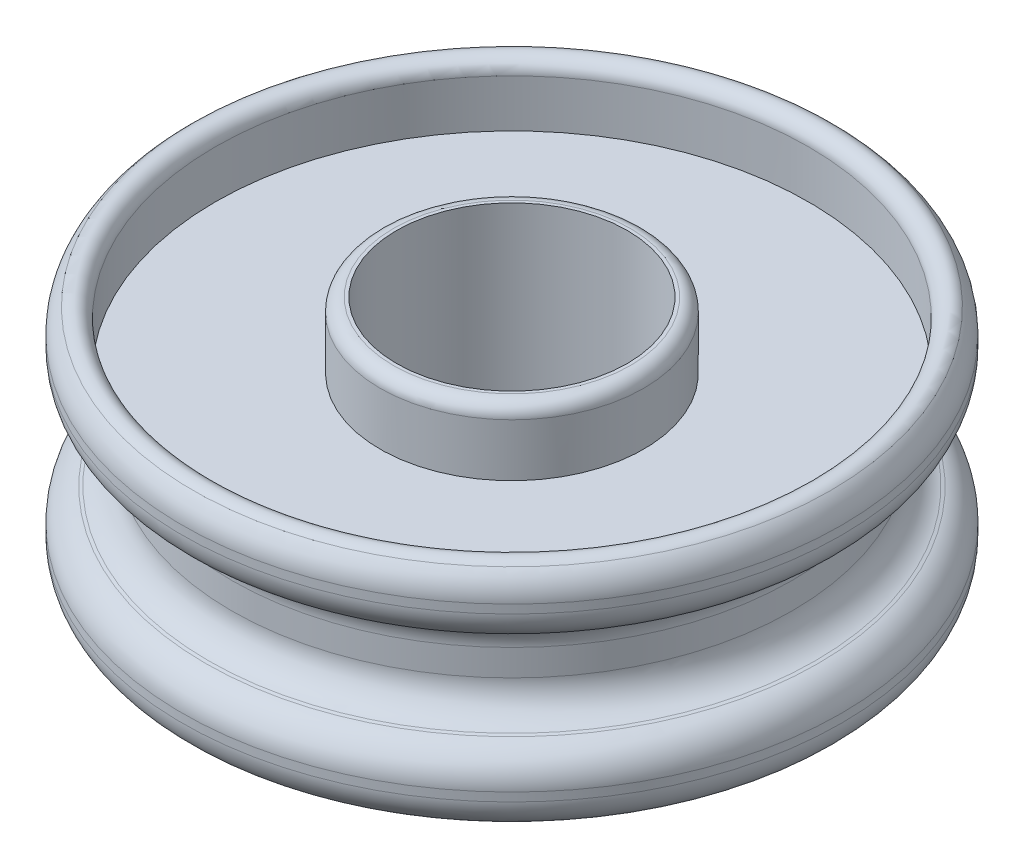
ISO-10303-21;
HEADER;
FILE_DESCRIPTION(('STEP AP214'),'2;1');
FILE_NAME('part.step','',(''),(''),'','','');
FILE_SCHEMA(('AUTOMOTIVE_DESIGN { 1 0 10303 214 1 1 1 1 }'));
ENDSEC;
DATA;
#1=APPLICATION_CONTEXT('core data for automotive mechanical design processes');
#2=APPLICATION_PROTOCOL_DEFINITION('international standard','automotive_design',2000,#1);
#3=PRODUCT_CONTEXT('',#1,'mechanical');
#4=PRODUCT('Part','Part','',(#3));
#5=PRODUCT_RELATED_PRODUCT_CATEGORY('part','',(#4));
#6=PRODUCT_DEFINITION_FORMATION('','',#4);
#7=PRODUCT_DEFINITION_CONTEXT('part definition',#1,'design');
#8=PRODUCT_DEFINITION('design','',#6,#7);
#9=PRODUCT_DEFINITION_SHAPE('','',#8);
#10=(LENGTH_UNIT() NAMED_UNIT(*) SI_UNIT(.MILLI.,.METRE.));
#11=(NAMED_UNIT(*) PLANE_ANGLE_UNIT() SI_UNIT($,.RADIAN.));
#12=(NAMED_UNIT(*) SI_UNIT($,.STERADIAN.) SOLID_ANGLE_UNIT());
#13=UNCERTAINTY_MEASURE_WITH_UNIT(LENGTH_MEASURE(1.E-05),#10,'distance_accuracy_value','');
#14=(GEOMETRIC_REPRESENTATION_CONTEXT(3) GLOBAL_UNCERTAINTY_ASSIGNED_CONTEXT((#13)) GLOBAL_UNIT_ASSIGNED_CONTEXT((#10,
#11,#12)) REPRESENTATION_CONTEXT('',''));
#15=CARTESIAN_POINT('',(0.,0.,0.));
#16=DIRECTION('',(0.,0.,1.));
#17=DIRECTION('',(1.,0.,0.));
#18=AXIS2_PLACEMENT_3D('',#15,#16,#17);
#19=CARTESIAN_POINT('',(0.,-36.0000000000001,0.));
#20=DIRECTION('',(0.,-1.,0.));
#21=DIRECTION('',(1.,0.,0.));
#22=AXIS2_PLACEMENT_3D('',#19,#20,#21);
#23=PLANE('',#22);
#24=CARTESIAN_POINT('',(1.23488963959887E-13,-36.0000000000001,0.));
#25=DIRECTION('',(0.,-1.,0.));
#26=DIRECTION('',(1.,0.,0.));
#27=AXIS2_PLACEMENT_3D('',#24,#25,#26);
#28=CIRCLE('',#27,18.);
#29=CARTESIAN_POINT('',(18.0000000000001,-36.,0.));
#30=VERTEX_POINT('',#29);
#31=EDGE_CURVE('E60',#30,#30,#28,.T.);
#32=ORIENTED_EDGE('',*,*,#31,.T.);
#33=EDGE_LOOP('',(#32));
#34=FACE_BOUND('',#33,.T.);
#35=CARTESIAN_POINT('',(1.23488963959887E-13,-36.,0.));
#36=DIRECTION('',(0.,-1.,0.));
#37=DIRECTION('',(1.,0.,0.));
#38=AXIS2_PLACEMENT_3D('',#35,#36,#37);
#39=CIRCLE('',#38,17.4999999999999);
#40=CARTESIAN_POINT('',(17.5,-36.,0.));
#41=VERTEX_POINT('',#40);
#42=EDGE_CURVE('E110',#41,#41,#39,.T.);
#43=ORIENTED_EDGE('',*,*,#42,.F.);
#44=EDGE_LOOP('',(#43));
#45=FACE_BOUND('',#44,.T.);
#46=ADVANCED_FACE('F45',(#34,#45),#23,.T.);
#47=CARTESIAN_POINT('',(0.,-1.0719528121518E-13,0.));
#48=DIRECTION('',(0.,-1.,0.));
#49=DIRECTION('',(1.,0.,0.));
#50=AXIS2_PLACEMENT_3D('',#47,#48,#49);
#51=PLANE('',#50);
#52=CARTESIAN_POINT('',(0.,-1.07119174641568E-13,0.));
#53=DIRECTION('',(0.,-1.,0.));
#54=DIRECTION('',(1.,0.,0.));
#55=AXIS2_PLACEMENT_3D('',#52,#53,#54);
#56=CIRCLE('',#55,18.);
#57=CARTESIAN_POINT('',(18.,0.,0.));
#58=VERTEX_POINT('',#57);
#59=EDGE_CURVE('E68',#58,#58,#56,.F.);
#60=ORIENTED_EDGE('',*,*,#59,.T.);
#61=EDGE_LOOP('',(#60));
#62=FACE_BOUND('',#61,.T.);
#63=CARTESIAN_POINT('',(0.,0.,0.));
#64=DIRECTION('',(0.,-1.,0.));
#65=DIRECTION('',(1.,0.,0.));
#66=AXIS2_PLACEMENT_3D('',#63,#64,#65);
#67=CIRCLE('',#66,17.5);
#68=CARTESIAN_POINT('',(17.5,0.,0.));
#69=VERTEX_POINT('',#68);
#70=EDGE_CURVE('E107',#69,#69,#67,.T.);
#71=ORIENTED_EDGE('',*,*,#70,.T.);
#72=EDGE_LOOP('',(#71));
#73=FACE_BOUND('',#72,.T.);
#74=ADVANCED_FACE('F148',(#62,#73),#51,.F.);
#75=CARTESIAN_POINT('',(1.04083408558608E-13,-31.0000000000002,0.));
#76=DIRECTION('',(0.,-1.,0.));
#77=DIRECTION('',(1.,0.,0.));
#78=AXIS2_PLACEMENT_3D('',#75,#76,#77);
#79=TOROIDAL_SURFACE('',#78,44.9999999999999,4.99999999999999);
#80=CARTESIAN_POINT('',(1.1686719179404E-13,-34.7267799624999,0.));
#81=DIRECTION('',(0.,1.,0.));
#82=DIRECTION('',(-1.,0.,0.));
#83=AXIS2_PLACEMENT_3D('',#80,#81,#82);
#84=CIRCLE('',#83,48.3333333333332);
#85=CARTESIAN_POINT('',(-48.3333333333331,-34.7267799625001,0.));
#86=VERTEX_POINT('',#85);
#87=EDGE_CURVE('E11',#86,#86,#84,.T.);
#88=ORIENTED_EDGE('',*,*,#87,.T.);
#89=EDGE_LOOP('',(#88));
#90=FACE_BOUND('',#89,.T.);
#91=CARTESIAN_POINT('',(1.06337718965459E-13,-31.0000000000001,0.));
#92=DIRECTION('',(0.,-1.,0.));
#93=DIRECTION('',(1.,0.,0.));
#94=AXIS2_PLACEMENT_3D('',#91,#92,#93);
#95=CIRCLE('',#94,49.9999999999999);
#96=CARTESIAN_POINT('',(50.,-31.,0.));
#97=VERTEX_POINT('',#96);
#98=EDGE_CURVE('E77',#97,#97,#95,.T.);
#99=ORIENTED_EDGE('',*,*,#98,.T.);
#100=EDGE_LOOP('',(#99));
#101=FACE_BOUND('',#100,.T.);
#102=ADVANCED_FACE('F155',(#90,#101),#79,.T.);
#103=CARTESIAN_POINT('',(6.24133963278391E-12,-1819.50046040718,0.));
#104=DIRECTION('',(0.,-1.,0.));
#105=DIRECTION('',(1.,0.,0.));
#106=AXIS2_PLACEMENT_3D('',#103,#104,#105);
#107=CYLINDRICAL_SURFACE('',#106,49.9999999999999);
#108=ORIENTED_EDGE('',*,*,#98,.F.);
#109=EDGE_LOOP('',(#108));
#110=FACE_BOUND('',#109,.T.);
#111=CARTESIAN_POINT('',(1.01855673767764E-13,-29.6933761370821,0.));
#112=DIRECTION('',(0.,-1.,0.));
#113=DIRECTION('',(1.,0.,0.));
#114=AXIS2_PLACEMENT_3D('',#111,#112,#113);
#115=CIRCLE('',#114,49.9999999999999);
#116=CARTESIAN_POINT('',(50.,-29.6933761370819,0.));
#117=VERTEX_POINT('',#116);
#118=EDGE_CURVE('E80',#117,#117,#115,.T.);
#119=ORIENTED_EDGE('',*,*,#118,.T.);
#120=EDGE_LOOP('',(#119));
#121=FACE_BOUND('',#120,.T.);
#122=ADVANCED_FACE('F202',(#110,#121),#107,.T.);
#123=CARTESIAN_POINT('',(0.,-29.6933761370821,0.));
#124=DIRECTION('',(0.,-1.,0.));
#125=DIRECTION('',(1.,0.,0.));
#126=AXIS2_PLACEMENT_3D('',#123,#124,#125);
#127=TOROIDAL_SURFACE('',#126,44.9999999999999,5.);
#128=ORIENTED_EDGE('',*,*,#118,.F.);
#129=EDGE_LOOP('',(#128));
#130=FACE_BOUND('',#129,.T.);
#131=CARTESIAN_POINT('',(0.,-24.914289766828,0.));
#132=DIRECTION('',(0.,-1.,0.));
#133=DIRECTION('',(1.,0.,0.));
#134=AXIS2_PLACEMENT_3D('',#131,#132,#133);
#135=CIRCLE('',#134,46.4698072886099);
#136=CARTESIAN_POINT('',(46.46980728861,-24.9142897668278,0.));
#137=VERTEX_POINT('',#136);
#138=EDGE_CURVE('E83',#137,#137,#135,.T.);
#139=ORIENTED_EDGE('',*,*,#138,.T.);
#140=EDGE_LOOP('',(#139));
#141=FACE_BOUND('',#140,.T.);
#142=ADVANCED_FACE('F198',(#130,#141),#127,.T.);
#143=CARTESIAN_POINT('',(0.,-24.914289766828,0.));
#144=DIRECTION('',(0.,-1.,0.));
#145=DIRECTION('',(1.,0.,0.));
#146=AXIS2_PLACEMENT_3D('',#143,#144,#145);
#147=CONICAL_SURFACE('',#146,46.4698072886099,1.272427538918);
#148=CARTESIAN_POINT('',(0.,-24.7790863702544,0.));
#149=DIRECTION('',(0.,-1.,0.));
#150=DIRECTION('',(1.,0.,0.));
#151=AXIS2_PLACEMENT_3D('',#148,#149,#150);
#152=CIRCLE('',#151,46.0301927113899);
#153=CARTESIAN_POINT('',(46.03019271139,-24.7790863702542,0.));
#154=VERTEX_POINT('',#153);
#155=EDGE_CURVE('E86',#154,#154,#152,.T.);
#156=ORIENTED_EDGE('',*,*,#155,.T.);
#157=EDGE_LOOP('',(#156));
#158=FACE_BOUND('',#157,.T.);
#159=ORIENTED_EDGE('',*,*,#138,.F.);
#160=EDGE_LOOP('',(#159));
#161=FACE_BOUND('',#160,.T.);
#162=ADVANCED_FACE('F194',(#158,#161),#147,.T.);
#163=CARTESIAN_POINT('',(0.,-20.0000000000002,0.));
#164=DIRECTION('',(0.,-1.,0.));
#165=DIRECTION('',(1.,0.,0.));
#166=AXIS2_PLACEMENT_3D('',#163,#164,#165);
#167=TOROIDAL_SURFACE('',#166,47.4999999999999,5.);
#168=ORIENTED_EDGE('',*,*,#155,.F.);
#169=EDGE_LOOP('',(#168));
#170=FACE_BOUND('',#169,.T.);
#171=CARTESIAN_POINT('',(0.,-20.0000000000002,0.));
#172=DIRECTION('',(0.,-1.,0.));
#173=DIRECTION('',(1.,0.,0.));
#174=AXIS2_PLACEMENT_3D('',#171,#172,#173);
#175=CIRCLE('',#174,42.5);
#176=CARTESIAN_POINT('',(42.5,-20.0000000000001,0.));
#177=VERTEX_POINT('',#176);
#178=EDGE_CURVE('E89',#177,#177,#175,.T.);
#179=ORIENTED_EDGE('',*,*,#178,.T.);
#180=EDGE_LOOP('',(#179));
#181=FACE_BOUND('',#180,.T.);
#182=ADVANCED_FACE('F190',(#170,#181),#167,.F.);
#183=CARTESIAN_POINT('',(6.24133963278391E-12,-1819.50046040718,0.));
#184=DIRECTION('',(0.,-1.,0.));
#185=DIRECTION('',(1.,0.,0.));
#186=AXIS2_PLACEMENT_3D('',#183,#184,#185);
#187=CYLINDRICAL_SURFACE('',#186,42.4999999999999);
#188=ORIENTED_EDGE('',*,*,#178,.F.);
#189=EDGE_LOOP('',(#188));
#190=FACE_BOUND('',#189,.T.);
#191=CARTESIAN_POINT('',(0.,-16.0000000000002,0.));
#192=DIRECTION('',(0.,-1.,0.));
#193=DIRECTION('',(1.,0.,0.));
#194=AXIS2_PLACEMENT_3D('',#191,#192,#193);
#195=CIRCLE('',#194,42.5);
#196=CARTESIAN_POINT('',(42.5,-16.0000000000001,0.));
#197=VERTEX_POINT('',#196);
#198=EDGE_CURVE('E92',#197,#197,#195,.T.);
#199=ORIENTED_EDGE('',*,*,#198,.T.);
#200=EDGE_LOOP('',(#199));
#201=FACE_BOUND('',#200,.T.);
#202=ADVANCED_FACE('F186',(#190,#201),#187,.T.);
#203=CARTESIAN_POINT('',(0.,-16.0000000000002,0.));
#204=DIRECTION('',(0.,-1.,0.));
#205=DIRECTION('',(1.,0.,0.));
#206=AXIS2_PLACEMENT_3D('',#203,#204,#205);
#207=TOROIDAL_SURFACE('',#206,47.4999999999999,5.);
#208=CARTESIAN_POINT('',(0.,-11.2209136297461,0.));
#209=DIRECTION('',(0.,-1.,0.));
#210=DIRECTION('',(1.,0.,0.));
#211=AXIS2_PLACEMENT_3D('',#208,#209,#210);
#212=CIRCLE('',#211,46.03019271139);
#213=CARTESIAN_POINT('',(46.03019271139,-11.2209136297459,0.));
#214=VERTEX_POINT('',#213);
#215=EDGE_CURVE('E95',#214,#214,#212,.T.);
#216=ORIENTED_EDGE('',*,*,#215,.T.);
#217=EDGE_LOOP('',(#216));
#218=FACE_BOUND('',#217,.T.);
#219=ORIENTED_EDGE('',*,*,#198,.F.);
#220=EDGE_LOOP('',(#219));
#221=FACE_BOUND('',#220,.T.);
#222=ADVANCED_FACE('F182',(#218,#221),#207,.F.);
#223=CARTESIAN_POINT('',(0.,-11.0857102331725,0.));
#224=DIRECTION('',(0.,1.,0.));
#225=DIRECTION('',(-1.,0.,0.));
#226=AXIS2_PLACEMENT_3D('',#223,#224,#225);
#227=CONICAL_SURFACE('',#226,46.4698072886099,1.272427538918);
#228=ORIENTED_EDGE('',*,*,#215,.F.);
#229=EDGE_LOOP('',(#228));
#230=FACE_BOUND('',#229,.T.);
#231=CARTESIAN_POINT('',(0.,-11.0857102331725,0.));
#232=DIRECTION('',(0.,-1.,0.));
#233=DIRECTION('',(1.,0.,0.));
#234=AXIS2_PLACEMENT_3D('',#231,#232,#233);
#235=CIRCLE('',#234,46.4698072886099);
#236=CARTESIAN_POINT('',(46.46980728861,-11.0857102331723,0.));
#237=VERTEX_POINT('',#236);
#238=EDGE_CURVE('E98',#237,#237,#235,.T.);
#239=ORIENTED_EDGE('',*,*,#238,.T.);
#240=EDGE_LOOP('',(#239));
#241=FACE_BOUND('',#240,.T.);
#242=ADVANCED_FACE('F178',(#230,#241),#227,.T.);
#243=CARTESIAN_POINT('',(0.,-6.3066238629183,0.));
#244=DIRECTION('',(0.,-1.,0.));
#245=DIRECTION('',(1.,0.,0.));
#246=AXIS2_PLACEMENT_3D('',#243,#244,#245);
#247=TOROIDAL_SURFACE('',#246,45.,5.);
#248=CARTESIAN_POINT('',(0.,-6.30662386291836,0.));
#249=DIRECTION('',(0.,-1.,0.));
#250=DIRECTION('',(1.,0.,0.));
#251=AXIS2_PLACEMENT_3D('',#248,#249,#250);
#252=CIRCLE('',#251,50.);
#253=CARTESIAN_POINT('',(50.,-6.30662386291819,0.));
#254=VERTEX_POINT('',#253);
#255=EDGE_CURVE('E101',#254,#254,#252,.T.);
#256=ORIENTED_EDGE('',*,*,#255,.T.);
#257=EDGE_LOOP('',(#256));
#258=FACE_BOUND('',#257,.T.);
#259=ORIENTED_EDGE('',*,*,#238,.F.);
#260=EDGE_LOOP('',(#259));
#261=FACE_BOUND('',#260,.T.);
#262=ADVANCED_FACE('F174',(#258,#261),#247,.T.);
#263=CARTESIAN_POINT('',(6.24133963278391E-12,-1819.50046040718,0.));
#264=DIRECTION('',(0.,-1.,0.));
#265=DIRECTION('',(1.,0.,0.));
#266=AXIS2_PLACEMENT_3D('',#263,#264,#265);
#267=CYLINDRICAL_SURFACE('',#266,50.);
#268=ORIENTED_EDGE('',*,*,#255,.F.);
#269=EDGE_LOOP('',(#268));
#270=FACE_BOUND('',#269,.T.);
#271=CARTESIAN_POINT('',(0.,-5.00000000000012,0.));
#272=DIRECTION('',(0.,-1.,0.));
#273=DIRECTION('',(1.,0.,0.));
#274=AXIS2_PLACEMENT_3D('',#271,#272,#273);
#275=CIRCLE('',#274,50.);
#276=CARTESIAN_POINT('',(50.,-4.99999999999994,0.));
#277=VERTEX_POINT('',#276);
#278=EDGE_CURVE('E104',#277,#277,#275,.T.);
#279=ORIENTED_EDGE('',*,*,#278,.T.);
#280=EDGE_LOOP('',(#279));
#281=FACE_BOUND('',#280,.T.);
#282=ADVANCED_FACE('F170',(#270,#281),#267,.T.);
#283=CARTESIAN_POINT('',(0.,-5.00000000000023,0.));
#284=DIRECTION('',(0.,-1.,0.));
#285=DIRECTION('',(1.,0.,0.));
#286=AXIS2_PLACEMENT_3D('',#283,#284,#285);
#287=TOROIDAL_SURFACE('',#286,45.,5.00000000000001);
#288=CARTESIAN_POINT('',(0.,-1.27322003750056,0.));
#289=DIRECTION('',(0.,-1.,0.));
#290=DIRECTION('',(1.,0.,0.));
#291=AXIS2_PLACEMENT_3D('',#288,#289,#290);
#292=CIRCLE('',#291,48.3333333333334);
#293=CARTESIAN_POINT('',(48.3333333333334,-1.2732200375004,0.));
#294=VERTEX_POINT('',#293);
#295=EDGE_CURVE('E71',#294,#294,#292,.T.);
#296=ORIENTED_EDGE('',*,*,#295,.T.);
#297=EDGE_LOOP('',(#296));
#298=FACE_BOUND('',#297,.T.);
#299=ORIENTED_EDGE('',*,*,#278,.F.);
#300=EDGE_LOOP('',(#299));
#301=FACE_BOUND('',#300,.T.);
#302=ADVANCED_FACE('F165',(#298,#301),#287,.T.);
#303=CARTESIAN_POINT('',(6.24133963278391E-12,-1819.50046040718,0.));
#304=DIRECTION('',(0.,-1.,0.));
#305=DIRECTION('',(1.,0.,0.));
#306=AXIS2_PLACEMENT_3D('',#303,#304,#305);
#307=CYLINDRICAL_SURFACE('',#306,17.4999999999999);
#308=ORIENTED_EDGE('',*,*,#42,.T.);
#309=EDGE_LOOP('',(#308));
#310=FACE_BOUND('',#309,.T.);
#311=ORIENTED_EDGE('',*,*,#70,.F.);
#312=EDGE_LOOP('',(#311));
#313=FACE_BOUND('',#312,.T.);
#314=ADVANCED_FACE('F163',(#310,#313),#307,.F.);
#315=CARTESIAN_POINT('',(0.,-10.,0.));
#316=DIRECTION('',(0.,1.,0.));
#317=DIRECTION('',(-1.,0.,0.));
#318=AXIS2_PLACEMENT_3D('',#315,#316,#317);
#319=CYLINDRICAL_SURFACE('',#318,45.);
#320=CARTESIAN_POINT('',(0.,-2.76393202250045,0.));
#321=DIRECTION('',(0.,-1.,0.));
#322=DIRECTION('',(1.,0.,0.));
#323=AXIS2_PLACEMENT_3D('',#320,#321,#322);
#324=CIRCLE('',#323,45.);
#325=CARTESIAN_POINT('',(45.,-2.76393202250029,0.));
#326=VERTEX_POINT('',#325);
#327=EDGE_CURVE('E74',#326,#326,#324,.F.);
#328=ORIENTED_EDGE('',*,*,#327,.T.);
#329=EDGE_LOOP('',(#328));
#330=FACE_BOUND('',#329,.T.);
#331=CARTESIAN_POINT('',(0.,-10.,0.));
#332=DIRECTION('',(0.,1.,0.));
#333=DIRECTION('',(-1.,0.,0.));
#334=AXIS2_PLACEMENT_3D('',#331,#332,#333);
#335=CIRCLE('',#334,45.);
#336=CARTESIAN_POINT('',(-45.,-10.0000000000002,0.));
#337=VERTEX_POINT('',#336);
#338=EDGE_CURVE('E113',#337,#337,#335,.T.);
#339=ORIENTED_EDGE('',*,*,#338,.F.);
#340=EDGE_LOOP('',(#339));
#341=FACE_BOUND('',#340,.T.);
#342=ADVANCED_FACE('F161',(#330,#341),#319,.F.);
#343=CARTESIAN_POINT('',(0.,-10.,0.));
#344=DIRECTION('',(0.,1.,0.));
#345=DIRECTION('',(-1.,0.,0.));
#346=AXIS2_PLACEMENT_3D('',#343,#344,#345);
#347=PLANE('',#346);
#348=CARTESIAN_POINT('',(0.,-10.,0.));
#349=DIRECTION('',(0.,1.,0.));
#350=DIRECTION('',(-1.,0.,0.));
#351=AXIS2_PLACEMENT_3D('',#348,#349,#350);
#352=CIRCLE('',#351,20.);
#353=CARTESIAN_POINT('',(-20.,-10.0000000000001,0.));
#354=VERTEX_POINT('',#353);
#355=EDGE_CURVE('E116',#354,#354,#352,.T.);
#356=ORIENTED_EDGE('',*,*,#355,.F.);
#357=EDGE_LOOP('',(#356));
#358=FACE_BOUND('',#357,.T.);
#359=ORIENTED_EDGE('',*,*,#338,.T.);
#360=EDGE_LOOP('',(#359));
#361=FACE_BOUND('',#360,.T.);
#362=ADVANCED_FACE('F271',(#358,#361),#347,.T.);
#363=CARTESIAN_POINT('',(0.,-10.,0.));
#364=DIRECTION('',(0.,1.,0.));
#365=DIRECTION('',(-1.,0.,0.));
#366=AXIS2_PLACEMENT_3D('',#363,#364,#365);
#367=CYLINDRICAL_SURFACE('',#366,20.);
#368=CARTESIAN_POINT('',(0.,-2.00000000000011,0.));
#369=DIRECTION('',(0.,-1.,0.));
#370=DIRECTION('',(1.,0.,0.));
#371=AXIS2_PLACEMENT_3D('',#368,#369,#370);
#372=CIRCLE('',#371,20.);
#373=CARTESIAN_POINT('',(20.,-2.00000000000004,0.));
#374=VERTEX_POINT('',#373);
#375=EDGE_CURVE('E65',#374,#374,#372,.T.);
#376=ORIENTED_EDGE('',*,*,#375,.T.);
#377=EDGE_LOOP('',(#376));
#378=FACE_BOUND('',#377,.T.);
#379=ORIENTED_EDGE('',*,*,#355,.T.);
#380=EDGE_LOOP('',(#379));
#381=FACE_BOUND('',#380,.T.);
#382=ADVANCED_FACE('F209',(#378,#381),#367,.T.);
#383=CARTESIAN_POINT('',(0.,-2.76393202250045,0.));
#384=DIRECTION('',(0.,-1.,0.));
#385=DIRECTION('',(1.,0.,0.));
#386=AXIS2_PLACEMENT_3D('',#383,#384,#385);
#387=TOROIDAL_SURFACE('',#386,47.,2.);
#388=ORIENTED_EDGE('',*,*,#295,.F.);
#389=EDGE_LOOP('',(#388));
#390=FACE_BOUND('',#389,.T.);
#391=ORIENTED_EDGE('',*,*,#327,.F.);
#392=EDGE_LOOP('',(#391));
#393=FACE_BOUND('',#392,.T.);
#394=ADVANCED_FACE('F143',(#390,#393),#387,.T.);
#395=CARTESIAN_POINT('',(0.,-2.00000000000011,0.));
#396=DIRECTION('',(0.,-1.,0.));
#397=DIRECTION('',(1.,0.,0.));
#398=AXIS2_PLACEMENT_3D('',#395,#396,#397);
#399=TOROIDAL_SURFACE('',#398,18.,2.);
#400=ORIENTED_EDGE('',*,*,#375,.F.);
#401=EDGE_LOOP('',(#400));
#402=FACE_BOUND('',#401,.T.);
#403=ORIENTED_EDGE('',*,*,#59,.F.);
#404=EDGE_LOOP('',(#403));
#405=FACE_BOUND('',#404,.T.);
#406=ADVANCED_FACE('F136',(#402,#405),#399,.T.);
#407=CARTESIAN_POINT('',(0.,-26.0000000000001,0.));
#408=DIRECTION('',(0.,-1.,0.));
#409=DIRECTION('',(1.,0.,0.));
#410=AXIS2_PLACEMENT_3D('',#407,#408,#409);
#411=CYLINDRICAL_SURFACE('',#410,44.9999999999999);
#412=CARTESIAN_POINT('',(1.14007988906718E-13,-33.2360679775,0.));
#413=DIRECTION('',(0.,1.,0.));
#414=DIRECTION('',(-1.,0.,0.));
#415=AXIS2_PLACEMENT_3D('',#412,#413,#414);
#416=CIRCLE('',#415,44.9999999999999);
#417=CARTESIAN_POINT('',(-44.9999999999998,-33.2360679775002,0.));
#418=VERTEX_POINT('',#417);
#419=EDGE_CURVE('E52',#418,#418,#416,.F.);
#420=ORIENTED_EDGE('',*,*,#419,.T.);
#421=EDGE_LOOP('',(#420));
#422=FACE_BOUND('',#421,.T.);
#423=CARTESIAN_POINT('',(0.,-26.0000000000001,0.));
#424=DIRECTION('',(0.,-1.,0.));
#425=DIRECTION('',(1.,0.,0.));
#426=AXIS2_PLACEMENT_3D('',#423,#424,#425);
#427=CIRCLE('',#426,44.9999999999999);
#428=CARTESIAN_POINT('',(45.,-25.9999999999999,0.));
#429=VERTEX_POINT('',#428);
#430=EDGE_CURVE('E119',#429,#429,#427,.T.);
#431=ORIENTED_EDGE('',*,*,#430,.F.);
#432=EDGE_LOOP('',(#431));
#433=FACE_BOUND('',#432,.T.);
#434=ADVANCED_FACE('F131',(#422,#433),#411,.F.);
#435=CARTESIAN_POINT('',(0.,-26.0000000000001,0.));
#436=DIRECTION('',(0.,-1.,0.));
#437=DIRECTION('',(1.,0.,0.));
#438=AXIS2_PLACEMENT_3D('',#435,#436,#437);
#439=PLANE('',#438);
#440=CARTESIAN_POINT('',(0.,-26.0000000000001,0.));
#441=DIRECTION('',(0.,-1.,0.));
#442=DIRECTION('',(1.,0.,0.));
#443=AXIS2_PLACEMENT_3D('',#440,#441,#442);
#444=CIRCLE('',#443,20.);
#445=CARTESIAN_POINT('',(20.0000000000001,-26.,0.));
#446=VERTEX_POINT('',#445);
#447=EDGE_CURVE('E122',#446,#446,#444,.T.);
#448=ORIENTED_EDGE('',*,*,#447,.F.);
#449=EDGE_LOOP('',(#448));
#450=FACE_BOUND('',#449,.T.);
#451=ORIENTED_EDGE('',*,*,#430,.T.);
#452=EDGE_LOOP('',(#451));
#453=FACE_BOUND('',#452,.T.);
#454=ADVANCED_FACE('F128',(#450,#453),#439,.T.);
#455=CARTESIAN_POINT('',(0.,-26.0000000000001,0.));
#456=DIRECTION('',(0.,-1.,0.));
#457=DIRECTION('',(1.,0.,0.));
#458=AXIS2_PLACEMENT_3D('',#455,#456,#457);
#459=CYLINDRICAL_SURFACE('',#458,20.);
#460=CARTESIAN_POINT('',(1.16628465962116E-13,-34.0000000000001,0.));
#461=DIRECTION('',(0.,-1.,0.));
#462=DIRECTION('',(1.,0.,0.));
#463=AXIS2_PLACEMENT_3D('',#460,#461,#462);
#464=CIRCLE('',#463,20.);
#465=CARTESIAN_POINT('',(20.0000000000001,-34.,0.));
#466=VERTEX_POINT('',#465);
#467=EDGE_CURVE('E56',#466,#466,#464,.F.);
#468=ORIENTED_EDGE('',*,*,#467,.T.);
#469=EDGE_LOOP('',(#468));
#470=FACE_BOUND('',#469,.T.);
#471=ORIENTED_EDGE('',*,*,#447,.T.);
#472=EDGE_LOOP('',(#471));
#473=FACE_BOUND('',#472,.T.);
#474=ADVANCED_FACE('F126',(#470,#473),#459,.T.);
#475=CARTESIAN_POINT('',(1.16628465962116E-13,-34.0000000000001,0.));
#476=DIRECTION('',(0.,-1.,0.));
#477=DIRECTION('',(1.,0.,0.));
#478=AXIS2_PLACEMENT_3D('',#475,#476,#477);
#479=TOROIDAL_SURFACE('',#478,18.,2.);
#480=ORIENTED_EDGE('',*,*,#467,.F.);
#481=EDGE_LOOP('',(#480));
#482=FACE_BOUND('',#481,.T.);
#483=ORIENTED_EDGE('',*,*,#31,.F.);
#484=EDGE_LOOP('',(#483));
#485=FACE_BOUND('',#484,.T.);
#486=ADVANCED_FACE('F211',(#482,#485),#479,.T.);
#487=CARTESIAN_POINT('',(1.12880833703293E-13,-33.2360679775,0.));
#488=DIRECTION('',(0.,1.,0.));
#489=DIRECTION('',(-1.,0.,0.));
#490=AXIS2_PLACEMENT_3D('',#487,#488,#489);
#491=TOROIDAL_SURFACE('',#490,46.9999999999999,2.);
#492=ORIENTED_EDGE('',*,*,#87,.F.);
#493=EDGE_LOOP('',(#492));
#494=FACE_BOUND('',#493,.T.);
#495=ORIENTED_EDGE('',*,*,#419,.F.);
#496=EDGE_LOOP('',(#495));
#497=FACE_BOUND('',#496,.T.);
#498=ADVANCED_FACE('F47',(#494,#497),#491,.T.);
#499=CLOSED_SHELL('',(#46,#74,#102,#122,#142,#162,#182,#202,#222,#242,#262,#282,#302,#314,#342,
#362,#382,#394,#406,#434,#454,#474,#486,#498));
#500=MANIFOLD_SOLID_BREP('B2',#499);
#501=ADVANCED_BREP_SHAPE_REPRESENTATION('',(#18,#500),#14);
#502=SHAPE_DEFINITION_REPRESENTATION(#9,#501);
ENDSEC;
END-ISO-10303-21;
